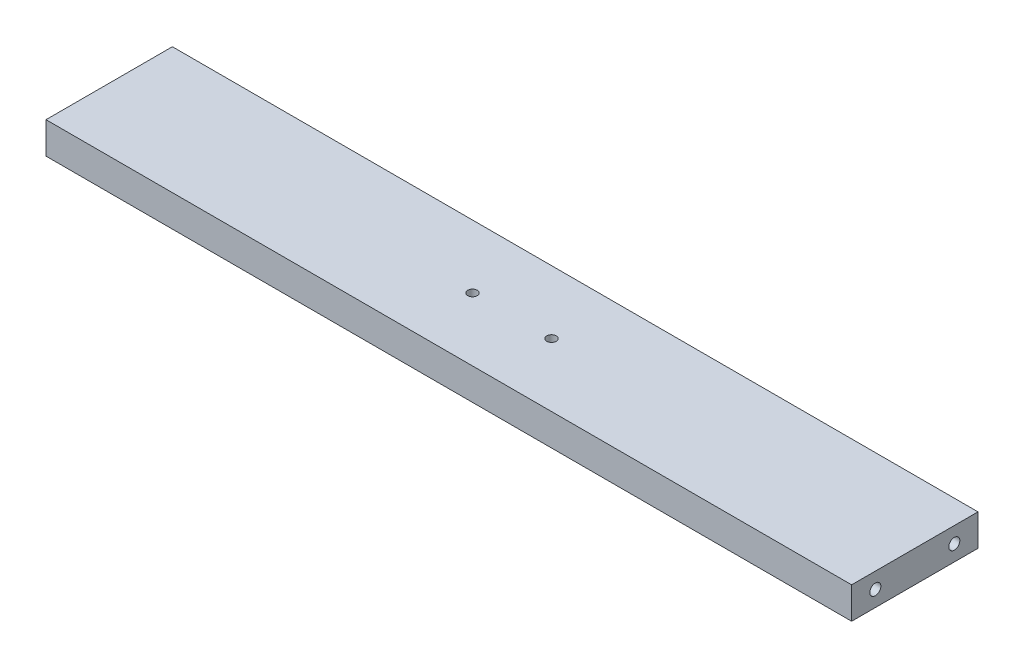
ISO-10303-21;
HEADER;
FILE_DESCRIPTION(('STEP AP214'),'2;1');
FILE_NAME('part.step','',(''),(''),'','','');
FILE_SCHEMA(('AUTOMOTIVE_DESIGN { 1 0 10303 214 1 1 1 1 }'));
ENDSEC;
DATA;
#1=APPLICATION_CONTEXT('core data for automotive mechanical design processes');
#2=APPLICATION_PROTOCOL_DEFINITION('international standard','automotive_design',2000,#1);
#3=PRODUCT_CONTEXT('',#1,'mechanical');
#4=PRODUCT('Part','Part','',(#3));
#5=PRODUCT_RELATED_PRODUCT_CATEGORY('part','',(#4));
#6=PRODUCT_DEFINITION_FORMATION('','',#4);
#7=PRODUCT_DEFINITION_CONTEXT('part definition',#1,'design');
#8=PRODUCT_DEFINITION('design','',#6,#7);
#9=PRODUCT_DEFINITION_SHAPE('','',#8);
#10=(LENGTH_UNIT() NAMED_UNIT(*) SI_UNIT(.MILLI.,.METRE.));
#11=(NAMED_UNIT(*) PLANE_ANGLE_UNIT() SI_UNIT($,.RADIAN.));
#12=(NAMED_UNIT(*) SI_UNIT($,.STERADIAN.) SOLID_ANGLE_UNIT());
#13=UNCERTAINTY_MEASURE_WITH_UNIT(LENGTH_MEASURE(1.E-05),#10,'distance_accuracy_value','');
#14=(GEOMETRIC_REPRESENTATION_CONTEXT(3) GLOBAL_UNCERTAINTY_ASSIGNED_CONTEXT((#13)) GLOBAL_UNIT_ASSIGNED_CONTEXT((#10,
#11,#12)) REPRESENTATION_CONTEXT('',''));
#15=CARTESIAN_POINT('',(0.,0.,0.));
#16=DIRECTION('',(0.,0.,1.));
#17=DIRECTION('',(1.,0.,0.));
#18=AXIS2_PLACEMENT_3D('',#15,#16,#17);
#19=CARTESIAN_POINT('',(-235.,9.99999999999999,-25.));
#20=DIRECTION('',(1.,0.,0.));
#21=DIRECTION('',(0.,0.,-1.));
#22=AXIS2_PLACEMENT_3D('',#19,#20,#21);
#23=PLANE('',#22);
#24=CARTESIAN_POINT('',(-235.,10.,-25.));
#25=DIRECTION('',(-1.,0.,0.));
#26=DIRECTION('',(0.,0.,1.));
#27=AXIS2_PLACEMENT_3D('',#24,#25,#26);
#28=CIRCLE('',#27,3.49999999999999);
#29=CARTESIAN_POINT('',(-235.,10.,-21.5));
#30=VERTEX_POINT('',#29);
#31=EDGE_CURVE('E20',#30,#30,#28,.T.);
#32=ORIENTED_EDGE('',*,*,#31,.T.);
#33=EDGE_LOOP('',(#32));
#34=FACE_BOUND('',#33,.T.);
#35=ADVANCED_FACE('F17',(#34),#23,.F.);
#36=CARTESIAN_POINT('',(-235.,9.99999999999999,25.));
#37=DIRECTION('',(1.,0.,0.));
#38=DIRECTION('',(0.,0.,-1.));
#39=AXIS2_PLACEMENT_3D('',#36,#37,#38);
#40=PLANE('',#39);
#41=CARTESIAN_POINT('',(-235.,10.,25.));
#42=DIRECTION('',(-1.,0.,0.));
#43=DIRECTION('',(0.,0.,1.));
#44=AXIS2_PLACEMENT_3D('',#41,#42,#43);
#45=CIRCLE('',#44,3.49999999999999);
#46=CARTESIAN_POINT('',(-235.,10.,28.5));
#47=VERTEX_POINT('',#46);
#48=EDGE_CURVE('E112',#47,#47,#45,.T.);
#49=ORIENTED_EDGE('',*,*,#48,.T.);
#50=EDGE_LOOP('',(#49));
#51=FACE_BOUND('',#50,.T.);
#52=ADVANCED_FACE('F185',(#51),#40,.F.);
#53=CARTESIAN_POINT('',(235.,9.99999999999999,-25.));
#54=DIRECTION('',(-1.,0.,0.));
#55=DIRECTION('',(0.,0.,1.));
#56=AXIS2_PLACEMENT_3D('',#53,#54,#55);
#57=PLANE('',#56);
#58=CARTESIAN_POINT('',(235.,10.,-25.));
#59=DIRECTION('',(1.,0.,0.));
#60=DIRECTION('',(0.,0.,-1.));
#61=AXIS2_PLACEMENT_3D('',#58,#59,#60);
#62=CIRCLE('',#61,3.49999999999999);
#63=CARTESIAN_POINT('',(235.,10.,-28.5));
#64=VERTEX_POINT('',#63);
#65=EDGE_CURVE('E110',#64,#64,#62,.T.);
#66=ORIENTED_EDGE('',*,*,#65,.T.);
#67=EDGE_LOOP('',(#66));
#68=FACE_BOUND('',#67,.T.);
#69=ADVANCED_FACE('F182',(#68),#57,.F.);
#70=CARTESIAN_POINT('',(235.,9.99999999999999,25.));
#71=DIRECTION('',(-1.,0.,0.));
#72=DIRECTION('',(0.,0.,1.));
#73=AXIS2_PLACEMENT_3D('',#70,#71,#72);
#74=PLANE('',#73);
#75=CARTESIAN_POINT('',(235.,10.,25.));
#76=DIRECTION('',(1.,0.,0.));
#77=DIRECTION('',(0.,0.,-1.));
#78=AXIS2_PLACEMENT_3D('',#75,#76,#77);
#79=CIRCLE('',#78,3.49999999999999);
#80=CARTESIAN_POINT('',(235.,10.,21.5));
#81=VERTEX_POINT('',#80);
#82=EDGE_CURVE('E107',#81,#81,#79,.T.);
#83=ORIENTED_EDGE('',*,*,#82,.T.);
#84=EDGE_LOOP('',(#83));
#85=FACE_BOUND('',#84,.T.);
#86=ADVANCED_FACE('F124',(#85),#74,.F.);
#87=CARTESIAN_POINT('',(-255.,10.,-25.));
#88=DIRECTION('',(-1.,0.,0.));
#89=DIRECTION('',(0.,0.,1.));
#90=AXIS2_PLACEMENT_3D('',#87,#88,#89);
#91=CYLINDRICAL_SURFACE('',#90,3.49999999999999);
#92=ORIENTED_EDGE('',*,*,#31,.F.);
#93=EDGE_LOOP('',(#92));
#94=FACE_BOUND('',#93,.T.);
#95=CARTESIAN_POINT('',(-255.,10.,-25.));
#96=DIRECTION('',(-1.,0.,0.));
#97=DIRECTION('',(0.,0.,1.));
#98=AXIS2_PLACEMENT_3D('',#95,#96,#97);
#99=CIRCLE('',#98,3.49999999999999);
#100=CARTESIAN_POINT('',(-255.,10.,-21.5));
#101=VERTEX_POINT('',#100);
#102=EDGE_CURVE('E101',#101,#101,#99,.T.);
#103=ORIENTED_EDGE('',*,*,#102,.T.);
#104=EDGE_LOOP('',(#103));
#105=FACE_BOUND('',#104,.T.);
#106=ADVANCED_FACE('F120',(#94,#105),#91,.F.);
#107=CARTESIAN_POINT('',(-255.,10.,25.));
#108=DIRECTION('',(-1.,0.,0.));
#109=DIRECTION('',(0.,0.,1.));
#110=AXIS2_PLACEMENT_3D('',#107,#108,#109);
#111=CYLINDRICAL_SURFACE('',#110,3.49999999999999);
#112=ORIENTED_EDGE('',*,*,#48,.F.);
#113=EDGE_LOOP('',(#112));
#114=FACE_BOUND('',#113,.T.);
#115=CARTESIAN_POINT('',(-255.,10.,25.));
#116=DIRECTION('',(-1.,0.,0.));
#117=DIRECTION('',(0.,0.,1.));
#118=AXIS2_PLACEMENT_3D('',#115,#116,#117);
#119=CIRCLE('',#118,3.49999999999999);
#120=CARTESIAN_POINT('',(-255.,10.,28.5));
#121=VERTEX_POINT('',#120);
#122=EDGE_CURVE('E70',#121,#121,#119,.T.);
#123=ORIENTED_EDGE('',*,*,#122,.T.);
#124=EDGE_LOOP('',(#123));
#125=FACE_BOUND('',#124,.T.);
#126=ADVANCED_FACE('F123',(#114,#125),#111,.F.);
#127=CARTESIAN_POINT('',(255.,10.,-25.));
#128=DIRECTION('',(1.,0.,0.));
#129=DIRECTION('',(0.,0.,-1.));
#130=AXIS2_PLACEMENT_3D('',#127,#128,#129);
#131=CYLINDRICAL_SURFACE('',#130,3.49999999999999);
#132=ORIENTED_EDGE('',*,*,#65,.F.);
#133=EDGE_LOOP('',(#132));
#134=FACE_BOUND('',#133,.T.);
#135=CARTESIAN_POINT('',(255.,10.,-25.));
#136=DIRECTION('',(1.,0.,0.));
#137=DIRECTION('',(0.,0.,-1.));
#138=AXIS2_PLACEMENT_3D('',#135,#136,#137);
#139=CIRCLE('',#138,3.49999999999999);
#140=CARTESIAN_POINT('',(255.,10.,-28.5));
#141=VERTEX_POINT('',#140);
#142=EDGE_CURVE('E76',#141,#141,#139,.T.);
#143=ORIENTED_EDGE('',*,*,#142,.T.);
#144=EDGE_LOOP('',(#143));
#145=FACE_BOUND('',#144,.T.);
#146=ADVANCED_FACE('F164',(#134,#145),#131,.F.);
#147=CARTESIAN_POINT('',(255.,10.,25.));
#148=DIRECTION('',(1.,0.,0.));
#149=DIRECTION('',(0.,0.,-1.));
#150=AXIS2_PLACEMENT_3D('',#147,#148,#149);
#151=CYLINDRICAL_SURFACE('',#150,3.49999999999999);
#152=ORIENTED_EDGE('',*,*,#82,.F.);
#153=EDGE_LOOP('',(#152));
#154=FACE_BOUND('',#153,.T.);
#155=CARTESIAN_POINT('',(255.,10.,25.));
#156=DIRECTION('',(1.,0.,0.));
#157=DIRECTION('',(0.,0.,-1.));
#158=AXIS2_PLACEMENT_3D('',#155,#156,#157);
#159=CIRCLE('',#158,3.49999999999999);
#160=CARTESIAN_POINT('',(255.,10.,21.5));
#161=VERTEX_POINT('',#160);
#162=EDGE_CURVE('E93',#161,#161,#159,.T.);
#163=ORIENTED_EDGE('',*,*,#162,.T.);
#164=EDGE_LOOP('',(#163));
#165=FACE_BOUND('',#164,.T.);
#166=ADVANCED_FACE('F166',(#154,#165),#151,.F.);
#167=CARTESIAN_POINT('',(0.,0.,0.));
#168=DIRECTION('',(0.,1.,0.));
#169=DIRECTION('',(0.,0.,1.));
#170=AXIS2_PLACEMENT_3D('',#167,#168,#169);
#171=PLANE('',#170);
#172=CARTESIAN_POINT('',(25.,0.,0.));
#173=DIRECTION('',(0.,-1.,0.));
#174=DIRECTION('',(0.,0.,-1.));
#175=AXIS2_PLACEMENT_3D('',#172,#173,#174);
#176=CIRCLE('',#175,3.);
#177=CARTESIAN_POINT('',(25.,0.,-2.99999999999999));
#178=VERTEX_POINT('',#177);
#179=EDGE_CURVE('E89',#178,#178,#176,.F.);
#180=ORIENTED_EDGE('',*,*,#179,.T.);
#181=EDGE_LOOP('',(#180));
#182=FACE_BOUND('',#181,.T.);
#183=DIRECTION('',(1.,0.,0.));
#184=VECTOR('',#183,1.);
#185=CARTESIAN_POINT('',(255.,0.,-40.));
#186=LINE('',#185,#184);
#187=CARTESIAN_POINT('',(-255.,0.,-40.));
#188=VERTEX_POINT('',#187);
#189=CARTESIAN_POINT('',(255.,0.,-40.));
#190=VERTEX_POINT('',#189);
#191=EDGE_CURVE('E92',#188,#190,#186,.T.);
#192=ORIENTED_EDGE('',*,*,#191,.T.);
#193=DIRECTION('',(0.,0.,1.));
#194=VECTOR('',#193,1.);
#195=CARTESIAN_POINT('',(255.,0.,40.));
#196=LINE('',#195,#194);
#197=CARTESIAN_POINT('',(255.,0.,40.));
#198=VERTEX_POINT('',#197);
#199=EDGE_CURVE('E74',#190,#198,#196,.T.);
#200=ORIENTED_EDGE('',*,*,#199,.T.);
#201=DIRECTION('',(-1.,0.,0.));
#202=VECTOR('',#201,1.);
#203=CARTESIAN_POINT('',(255.,0.,40.));
#204=LINE('',#203,#202);
#205=CARTESIAN_POINT('',(-255.,0.,40.));
#206=VERTEX_POINT('',#205);
#207=EDGE_CURVE('E55',#198,#206,#204,.T.);
#208=ORIENTED_EDGE('',*,*,#207,.T.);
#209=DIRECTION('',(0.,0.,-1.));
#210=VECTOR('',#209,1.);
#211=CARTESIAN_POINT('',(-255.,0.,40.));
#212=LINE('',#211,#210);
#213=EDGE_CURVE('E60',#206,#188,#212,.T.);
#214=ORIENTED_EDGE('',*,*,#213,.T.);
#215=EDGE_LOOP('',(#192,#200,#208,#214));
#216=FACE_BOUND('',#215,.T.);
#217=CARTESIAN_POINT('',(-25.,0.,0.));
#218=DIRECTION('',(0.,-1.,0.));
#219=DIRECTION('',(0.,0.,-1.));
#220=AXIS2_PLACEMENT_3D('',#217,#218,#219);
#221=CIRCLE('',#220,3.00000000000001);
#222=CARTESIAN_POINT('',(-25.,0.,-3.));
#223=VERTEX_POINT('',#222);
#224=EDGE_CURVE('E104',#223,#223,#221,.F.);
#225=ORIENTED_EDGE('',*,*,#224,.T.);
#226=EDGE_LOOP('',(#225));
#227=FACE_BOUND('',#226,.T.);
#228=ADVANCED_FACE('F72',(#182,#216,#227),#171,.F.);
#229=CARTESIAN_POINT('',(-25.,20.,0.));
#230=DIRECTION('',(0.,-1.,0.));
#231=DIRECTION('',(0.,0.,-1.));
#232=AXIS2_PLACEMENT_3D('',#229,#230,#231);
#233=CYLINDRICAL_SURFACE('',#232,3.00000000000001);
#234=CARTESIAN_POINT('',(-25.,20.,0.));
#235=DIRECTION('',(0.,-1.,0.));
#236=DIRECTION('',(0.,0.,-1.));
#237=AXIS2_PLACEMENT_3D('',#234,#235,#236);
#238=CIRCLE('',#237,3.00000000000001);
#239=CARTESIAN_POINT('',(-25.,20.,-3.));
#240=VERTEX_POINT('',#239);
#241=EDGE_CURVE('E85',#240,#240,#238,.T.);
#242=ORIENTED_EDGE('',*,*,#241,.F.);
#243=EDGE_LOOP('',(#242));
#244=FACE_BOUND('',#243,.T.);
#245=ORIENTED_EDGE('',*,*,#224,.F.);
#246=EDGE_LOOP('',(#245));
#247=FACE_BOUND('',#246,.T.);
#248=ADVANCED_FACE('F129',(#244,#247),#233,.F.);
#249=CARTESIAN_POINT('',(-255.,20.,40.));
#250=DIRECTION('',(1.,0.,0.));
#251=DIRECTION('',(0.,0.,-1.));
#252=AXIS2_PLACEMENT_3D('',#249,#250,#251);
#253=PLANE('',#252);
#254=DIRECTION('',(0.,1.,0.));
#255=VECTOR('',#254,1.);
#256=CARTESIAN_POINT('',(-255.,20.,40.));
#257=LINE('',#256,#255);
#258=CARTESIAN_POINT('',(-255.,20.,40.));
#259=VERTEX_POINT('',#258);
#260=EDGE_CURVE('E63',#206,#259,#257,.T.);
#261=ORIENTED_EDGE('',*,*,#260,.T.);
#262=DIRECTION('',(0.,0.,1.));
#263=VECTOR('',#262,1.);
#264=CARTESIAN_POINT('',(-255.,20.,0.));
#265=LINE('',#264,#263);
#266=CARTESIAN_POINT('',(-255.,20.,-40.));
#267=VERTEX_POINT('',#266);
#268=EDGE_CURVE('E88',#267,#259,#265,.T.);
#269=ORIENTED_EDGE('',*,*,#268,.F.);
#270=DIRECTION('',(0.,1.,0.));
#271=VECTOR('',#270,1.);
#272=CARTESIAN_POINT('',(-255.,20.,-40.));
#273=LINE('',#272,#271);
#274=EDGE_CURVE('E66',#267,#188,#273,.F.);
#275=ORIENTED_EDGE('',*,*,#274,.T.);
#276=ORIENTED_EDGE('',*,*,#213,.F.);
#277=EDGE_LOOP('',(#261,#269,#275,#276));
#278=FACE_BOUND('',#277,.T.);
#279=ORIENTED_EDGE('',*,*,#122,.F.);
#280=EDGE_LOOP('',(#279));
#281=FACE_BOUND('',#280,.T.);
#282=ORIENTED_EDGE('',*,*,#102,.F.);
#283=EDGE_LOOP('',(#282));
#284=FACE_BOUND('',#283,.T.);
#285=ADVANCED_FACE('F61',(#278,#281,#284),#253,.F.);
#286=CARTESIAN_POINT('',(255.,20.,40.));
#287=DIRECTION('',(0.,0.,-1.));
#288=DIRECTION('',(-1.,0.,0.));
#289=AXIS2_PLACEMENT_3D('',#286,#287,#288);
#290=PLANE('',#289);
#291=DIRECTION('',(0.,1.,0.));
#292=VECTOR('',#291,1.);
#293=CARTESIAN_POINT('',(255.,20.,40.));
#294=LINE('',#293,#292);
#295=CARTESIAN_POINT('',(255.,20.,40.));
#296=VERTEX_POINT('',#295);
#297=EDGE_CURVE('E96',#198,#296,#294,.T.);
#298=ORIENTED_EDGE('',*,*,#297,.T.);
#299=DIRECTION('',(1.,0.,0.));
#300=VECTOR('',#299,1.);
#301=CARTESIAN_POINT('',(0.,20.,40.));
#302=LINE('',#301,#300);
#303=EDGE_CURVE('E80',#259,#296,#302,.T.);
#304=ORIENTED_EDGE('',*,*,#303,.F.);
#305=ORIENTED_EDGE('',*,*,#260,.F.);
#306=ORIENTED_EDGE('',*,*,#207,.F.);
#307=EDGE_LOOP('',(#298,#304,#305,#306));
#308=FACE_BOUND('',#307,.T.);
#309=ADVANCED_FACE('F78',(#308),#290,.F.);
#310=CARTESIAN_POINT('',(255.,20.,40.));
#311=DIRECTION('',(-1.,0.,0.));
#312=DIRECTION('',(0.,0.,1.));
#313=AXIS2_PLACEMENT_3D('',#310,#311,#312);
#314=PLANE('',#313);
#315=DIRECTION('',(0.,1.,0.));
#316=VECTOR('',#315,1.);
#317=CARTESIAN_POINT('',(255.,20.,-40.));
#318=LINE('',#317,#316);
#319=CARTESIAN_POINT('',(255.,20.,-40.));
#320=VERTEX_POINT('',#319);
#321=EDGE_CURVE('E35',#190,#320,#318,.T.);
#322=ORIENTED_EDGE('',*,*,#321,.T.);
#323=DIRECTION('',(0.,0.,1.));
#324=VECTOR('',#323,1.);
#325=CARTESIAN_POINT('',(255.,20.,0.));
#326=LINE('',#325,#324);
#327=EDGE_CURVE('E296',#296,#320,#326,.F.);
#328=ORIENTED_EDGE('',*,*,#327,.F.);
#329=ORIENTED_EDGE('',*,*,#297,.F.);
#330=ORIENTED_EDGE('',*,*,#199,.F.);
#331=EDGE_LOOP('',(#322,#328,#329,#330));
#332=FACE_BOUND('',#331,.T.);
#333=ORIENTED_EDGE('',*,*,#162,.F.);
#334=EDGE_LOOP('',(#333));
#335=FACE_BOUND('',#334,.T.);
#336=ORIENTED_EDGE('',*,*,#142,.F.);
#337=EDGE_LOOP('',(#336));
#338=FACE_BOUND('',#337,.T.);
#339=ADVANCED_FACE('F136',(#332,#335,#338),#314,.F.);
#340=CARTESIAN_POINT('',(255.,20.,-40.));
#341=DIRECTION('',(0.,0.,1.));
#342=DIRECTION('',(1.,0.,0.));
#343=AXIS2_PLACEMENT_3D('',#340,#341,#342);
#344=PLANE('',#343);
#345=ORIENTED_EDGE('',*,*,#274,.F.);
#346=DIRECTION('',(1.,0.,0.));
#347=VECTOR('',#346,1.);
#348=CARTESIAN_POINT('',(0.,20.,-40.));
#349=LINE('',#348,#347);
#350=EDGE_CURVE('E26',#320,#267,#349,.F.);
#351=ORIENTED_EDGE('',*,*,#350,.F.);
#352=ORIENTED_EDGE('',*,*,#321,.F.);
#353=ORIENTED_EDGE('',*,*,#191,.F.);
#354=EDGE_LOOP('',(#345,#351,#352,#353));
#355=FACE_BOUND('',#354,.T.);
#356=ADVANCED_FACE('F148',(#355),#344,.F.);
#357=CARTESIAN_POINT('',(25.,20.,0.));
#358=DIRECTION('',(0.,-1.,0.));
#359=DIRECTION('',(0.,0.,-1.));
#360=AXIS2_PLACEMENT_3D('',#357,#358,#359);
#361=CYLINDRICAL_SURFACE('',#360,3.);
#362=CARTESIAN_POINT('',(25.,20.,0.));
#363=DIRECTION('',(0.,-1.,0.));
#364=DIRECTION('',(0.,0.,-1.));
#365=AXIS2_PLACEMENT_3D('',#362,#363,#364);
#366=CIRCLE('',#365,3.);
#367=CARTESIAN_POINT('',(25.,20.,-2.99999999999999));
#368=VERTEX_POINT('',#367);
#369=EDGE_CURVE('E11',#368,#368,#366,.T.);
#370=ORIENTED_EDGE('',*,*,#369,.F.);
#371=EDGE_LOOP('',(#370));
#372=FACE_BOUND('',#371,.T.);
#373=ORIENTED_EDGE('',*,*,#179,.F.);
#374=EDGE_LOOP('',(#373));
#375=FACE_BOUND('',#374,.T.);
#376=ADVANCED_FACE('F142',(#372,#375),#361,.F.);
#377=CARTESIAN_POINT('',(0.,20.,0.));
#378=DIRECTION('',(0.,1.,0.));
#379=DIRECTION('',(0.,0.,1.));
#380=AXIS2_PLACEMENT_3D('',#377,#378,#379);
#381=PLANE('',#380);
#382=ORIENTED_EDGE('',*,*,#369,.T.);
#383=EDGE_LOOP('',(#382));
#384=FACE_BOUND('',#383,.T.);
#385=ORIENTED_EDGE('',*,*,#327,.T.);
#386=ORIENTED_EDGE('',*,*,#350,.T.);
#387=ORIENTED_EDGE('',*,*,#268,.T.);
#388=ORIENTED_EDGE('',*,*,#303,.T.);
#389=EDGE_LOOP('',(#385,#386,#387,#388));
#390=FACE_BOUND('',#389,.T.);
#391=ORIENTED_EDGE('',*,*,#241,.T.);
#392=EDGE_LOOP('',(#391));
#393=FACE_BOUND('',#392,.T.);
#394=ADVANCED_FACE('F140',(#384,#390,#393),#381,.T.);
#395=CLOSED_SHELL('',(#35,#52,#69,#86,#106,#126,#146,#166,#228,#248,#285,#309,#339,#356,#376,#394));
#396=MANIFOLD_SOLID_BREP('B1',#395);
#397=ADVANCED_BREP_SHAPE_REPRESENTATION('',(#18,#396),#14);
#398=SHAPE_DEFINITION_REPRESENTATION(#9,#397);
ENDSEC;
END-ISO-10303-21;
